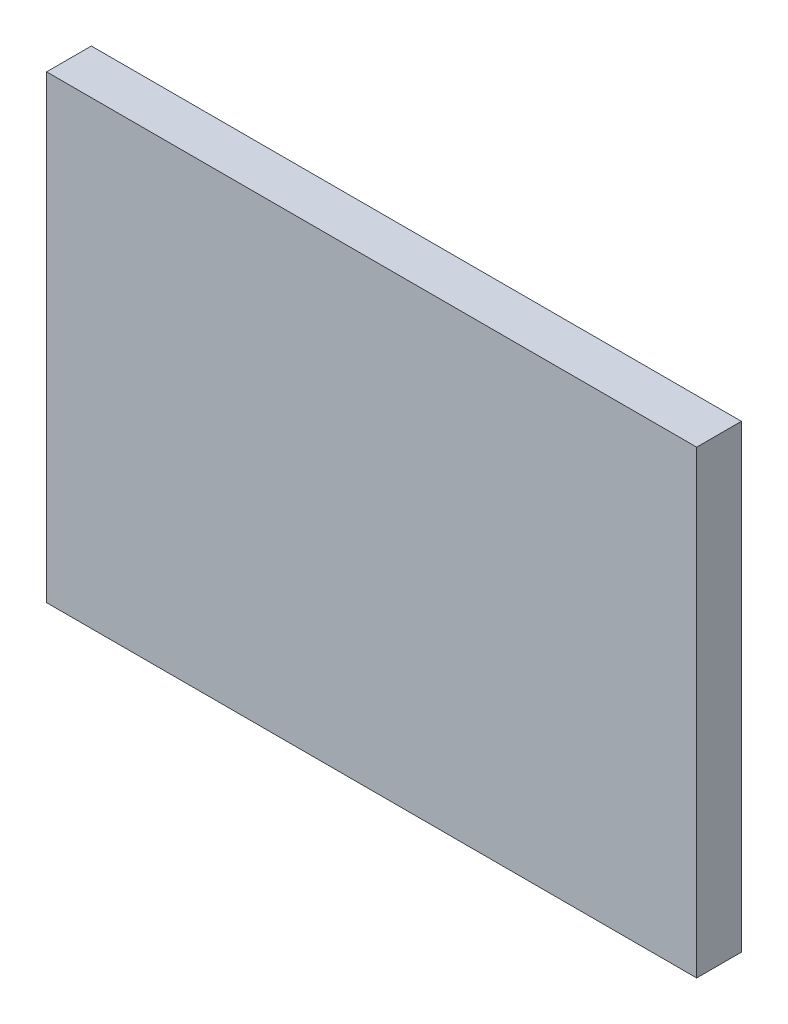
ISO-10303-21;
HEADER;
FILE_DESCRIPTION(('STEP AP214'),'2;1');
FILE_NAME('part.step','',(''),(''),'','','');
FILE_SCHEMA(('AUTOMOTIVE_DESIGN { 1 0 10303 214 1 1 1 1 }'));
ENDSEC;
DATA;
#1=APPLICATION_CONTEXT('core data for automotive mechanical design processes');
#2=APPLICATION_PROTOCOL_DEFINITION('international standard','automotive_design',2000,#1);
#3=PRODUCT_CONTEXT('',#1,'mechanical');
#4=PRODUCT('Part','Part','',(#3));
#5=PRODUCT_RELATED_PRODUCT_CATEGORY('part','',(#4));
#6=PRODUCT_DEFINITION_FORMATION('','',#4);
#7=PRODUCT_DEFINITION_CONTEXT('part definition',#1,'design');
#8=PRODUCT_DEFINITION('design','',#6,#7);
#9=PRODUCT_DEFINITION_SHAPE('','',#8);
#10=(LENGTH_UNIT() NAMED_UNIT(*) SI_UNIT(.MILLI.,.METRE.));
#11=(NAMED_UNIT(*) PLANE_ANGLE_UNIT() SI_UNIT($,.RADIAN.));
#12=(NAMED_UNIT(*) SI_UNIT($,.STERADIAN.) SOLID_ANGLE_UNIT());
#13=UNCERTAINTY_MEASURE_WITH_UNIT(LENGTH_MEASURE(1.E-05),#10,'distance_accuracy_value','');
#14=(GEOMETRIC_REPRESENTATION_CONTEXT(3) GLOBAL_UNCERTAINTY_ASSIGNED_CONTEXT((#13)) GLOBAL_UNIT_ASSIGNED_CONTEXT((#10,
#11,#12)) REPRESENTATION_CONTEXT('',''));
#15=CARTESIAN_POINT('',(0.,0.,0.));
#16=DIRECTION('',(0.,0.,1.));
#17=DIRECTION('',(1.,0.,0.));
#18=AXIS2_PLACEMENT_3D('',#15,#16,#17);
#19=CARTESIAN_POINT('',(31.250001,-22.09999898,4.30099978));
#20=DIRECTION('',(0.,0.,1.));
#21=DIRECTION('',(1.,0.,0.));
#22=AXIS2_PLACEMENT_3D('',#19,#20,#21);
#23=PLANE('',#22);
#24=DIRECTION('',(0.,1.,0.));
#25=VECTOR('',#24,1.);
#26=CARTESIAN_POINT('',(-31.24999846,-22.09999898,4.30099978));
#27=LINE('',#26,#25);
#28=CARTESIAN_POINT('',(-31.24999846,-22.09999898,4.30099978));
#29=VERTEX_POINT('',#28);
#30=CARTESIAN_POINT('',(-31.24999846,22.09999898,4.30099978));
#31=VERTEX_POINT('',#30);
#32=EDGE_CURVE('E53',#29,#31,#27,.T.);
#33=ORIENTED_EDGE('',*,*,#32,.F.);
#34=DIRECTION('',(1.,0.,0.));
#35=VECTOR('',#34,1.);
#36=CARTESIAN_POINT('',(31.250001,-22.09999898,4.30099978));
#37=LINE('',#36,#35);
#38=CARTESIAN_POINT('',(31.250001,-22.09999898,4.30099978));
#39=VERTEX_POINT('',#38);
#40=EDGE_CURVE('E68',#39,#29,#37,.F.);
#41=ORIENTED_EDGE('',*,*,#40,.F.);
#42=DIRECTION('',(0.,1.,0.));
#43=VECTOR('',#42,1.);
#44=CARTESIAN_POINT('',(31.250001,22.09999898,4.30099978));
#45=LINE('',#44,#43);
#46=CARTESIAN_POINT('',(31.250001,22.09999898,4.30099978));
#47=VERTEX_POINT('',#46);
#48=EDGE_CURVE('E20',#47,#39,#45,.F.);
#49=ORIENTED_EDGE('',*,*,#48,.F.);
#50=DIRECTION('',(1.,0.,0.));
#51=VECTOR('',#50,1.);
#52=CARTESIAN_POINT('',(-31.24999846,22.09999898,4.30099978));
#53=LINE('',#52,#51);
#54=EDGE_CURVE('E58',#31,#47,#53,.T.);
#55=ORIENTED_EDGE('',*,*,#54,.F.);
#56=EDGE_LOOP('',(#33,#41,#49,#55));
#57=FACE_BOUND('',#56,.T.);
#58=ADVANCED_FACE('F17',(#57),#23,.T.);
#59=CARTESIAN_POINT('',(31.250001,22.09999898,0.));
#60=DIRECTION('',(1.,0.,0.));
#61=DIRECTION('',(0.,0.,-1.));
#62=AXIS2_PLACEMENT_3D('',#59,#60,#61);
#63=PLANE('',#62);
#64=DIRECTION('',(0.,0.,-1.));
#65=VECTOR('',#64,1.);
#66=CARTESIAN_POINT('',(31.250001,-22.09999898,0.));
#67=LINE('',#66,#65);
#68=CARTESIAN_POINT('',(31.250001,-22.09999898,0.));
#69=VERTEX_POINT('',#68);
#70=EDGE_CURVE('E79',#69,#39,#67,.F.);
#71=ORIENTED_EDGE('',*,*,#70,.F.);
#72=DIRECTION('',(0.,1.,0.));
#73=VECTOR('',#72,1.);
#74=CARTESIAN_POINT('',(31.250001,-22.09999898,0.));
#75=LINE('',#74,#73);
#76=CARTESIAN_POINT('',(31.250001,22.09999898,0.));
#77=VERTEX_POINT('',#76);
#78=EDGE_CURVE('E74',#69,#77,#75,.T.);
#79=ORIENTED_EDGE('',*,*,#78,.T.);
#80=DIRECTION('',(0.,0.,1.));
#81=VECTOR('',#80,1.);
#82=CARTESIAN_POINT('',(31.250001,22.09999898,0.));
#83=LINE('',#82,#81);
#84=EDGE_CURVE('E63',#47,#77,#83,.F.);
#85=ORIENTED_EDGE('',*,*,#84,.F.);
#86=ORIENTED_EDGE('',*,*,#48,.T.);
#87=EDGE_LOOP('',(#71,#79,#85,#86));
#88=FACE_BOUND('',#87,.T.);
#89=ADVANCED_FACE('F73',(#88),#63,.T.);
#90=CARTESIAN_POINT('',(-31.24999846,22.09999898,0.));
#91=DIRECTION('',(0.,1.,0.));
#92=DIRECTION('',(0.,0.,1.));
#93=AXIS2_PLACEMENT_3D('',#90,#91,#92);
#94=PLANE('',#93);
#95=ORIENTED_EDGE('',*,*,#84,.T.);
#96=DIRECTION('',(1.,0.,0.));
#97=VECTOR('',#96,1.);
#98=CARTESIAN_POINT('',(31.250001,22.09999898,0.));
#99=LINE('',#98,#97);
#100=CARTESIAN_POINT('',(-31.24999846,22.09999898,0.));
#101=VERTEX_POINT('',#100);
#102=EDGE_CURVE('E84',#77,#101,#99,.F.);
#103=ORIENTED_EDGE('',*,*,#102,.T.);
#104=DIRECTION('',(0.,0.,1.));
#105=VECTOR('',#104,1.);
#106=CARTESIAN_POINT('',(-31.24999846,22.09999898,0.));
#107=LINE('',#106,#105);
#108=EDGE_CURVE('E65',#31,#101,#107,.F.);
#109=ORIENTED_EDGE('',*,*,#108,.F.);
#110=ORIENTED_EDGE('',*,*,#54,.T.);
#111=EDGE_LOOP('',(#95,#103,#109,#110));
#112=FACE_BOUND('',#111,.T.);
#113=ADVANCED_FACE('F60',(#112),#94,.T.);
#114=CARTESIAN_POINT('',(-31.24999846,-22.09999898,0.));
#115=DIRECTION('',(-1.,0.,0.));
#116=DIRECTION('',(0.,0.,1.));
#117=AXIS2_PLACEMENT_3D('',#114,#115,#116);
#118=PLANE('',#117);
#119=ORIENTED_EDGE('',*,*,#108,.T.);
#120=DIRECTION('',(0.,1.,0.));
#121=VECTOR('',#120,1.);
#122=CARTESIAN_POINT('',(-31.24999846,-22.09999898,0.));
#123=LINE('',#122,#121);
#124=CARTESIAN_POINT('',(-31.24999846,-22.09999898,0.));
#125=VERTEX_POINT('',#124);
#126=EDGE_CURVE('E26',#101,#125,#123,.F.);
#127=ORIENTED_EDGE('',*,*,#126,.T.);
#128=DIRECTION('',(0.,0.,-1.));
#129=VECTOR('',#128,1.);
#130=CARTESIAN_POINT('',(-31.24999846,-22.09999898,0.));
#131=LINE('',#130,#129);
#132=EDGE_CURVE('E34',#29,#125,#131,.T.);
#133=ORIENTED_EDGE('',*,*,#132,.F.);
#134=ORIENTED_EDGE('',*,*,#32,.T.);
#135=EDGE_LOOP('',(#119,#127,#133,#134));
#136=FACE_BOUND('',#135,.T.);
#137=ADVANCED_FACE('F88',(#136),#118,.T.);
#138=CARTESIAN_POINT('',(31.250001,-22.09999898,0.));
#139=DIRECTION('',(0.,-1.,0.));
#140=DIRECTION('',(0.,0.,-1.));
#141=AXIS2_PLACEMENT_3D('',#138,#139,#140);
#142=PLANE('',#141);
#143=ORIENTED_EDGE('',*,*,#132,.T.);
#144=DIRECTION('',(1.,0.,0.));
#145=VECTOR('',#144,1.);
#146=CARTESIAN_POINT('',(31.250001,-22.09999898,0.));
#147=LINE('',#146,#145);
#148=EDGE_CURVE('E11',#125,#69,#147,.T.);
#149=ORIENTED_EDGE('',*,*,#148,.T.);
#150=ORIENTED_EDGE('',*,*,#70,.T.);
#151=ORIENTED_EDGE('',*,*,#40,.T.);
#152=EDGE_LOOP('',(#143,#149,#150,#151));
#153=FACE_BOUND('',#152,.T.);
#154=ADVANCED_FACE('F91',(#153),#142,.T.);
#155=CARTESIAN_POINT('',(31.250001,-22.09999898,0.));
#156=DIRECTION('',(0.,0.,1.));
#157=DIRECTION('',(1.,0.,0.));
#158=AXIS2_PLACEMENT_3D('',#155,#156,#157);
#159=PLANE('',#158);
#160=ORIENTED_EDGE('',*,*,#126,.F.);
#161=ORIENTED_EDGE('',*,*,#102,.F.);
#162=ORIENTED_EDGE('',*,*,#78,.F.);
#163=ORIENTED_EDGE('',*,*,#148,.F.);
#164=EDGE_LOOP('',(#160,#161,#162,#163));
#165=FACE_BOUND('',#164,.T.);
#166=ADVANCED_FACE('F90',(#165),#159,.F.);
#167=CLOSED_SHELL('',(#58,#89,#113,#137,#154,#166));
#168=MANIFOLD_SOLID_BREP('B1',#167);
#169=ADVANCED_BREP_SHAPE_REPRESENTATION('',(#18,#168),#14);
#170=SHAPE_DEFINITION_REPRESENTATION(#9,#169);
ENDSEC;
END-ISO-10303-21;
